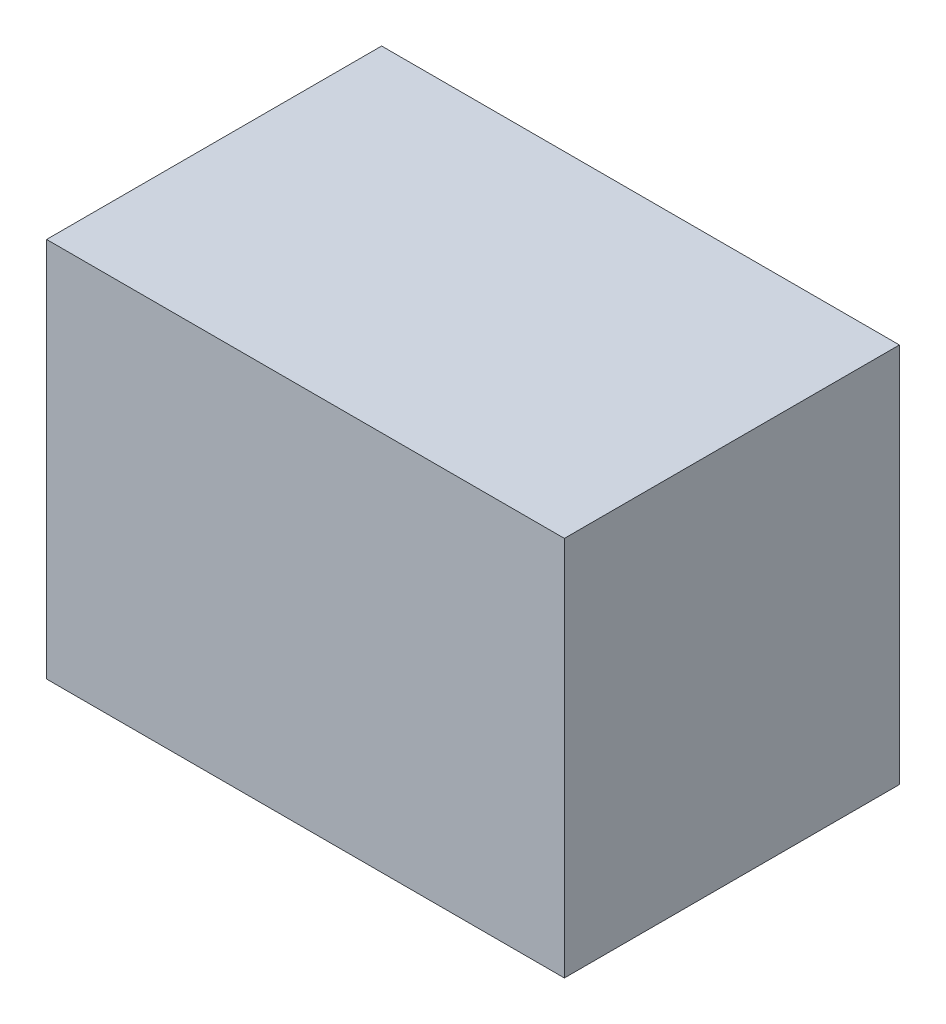
ISO-10303-21;
HEADER;
FILE_DESCRIPTION(('STEP AP214'),'2;1');
FILE_NAME('part.step','',(''),(''),'','','');
FILE_SCHEMA(('AUTOMOTIVE_DESIGN { 1 0 10303 214 1 1 1 1 }'));
ENDSEC;
DATA;
#1=APPLICATION_CONTEXT('core data for automotive mechanical design processes');
#2=APPLICATION_PROTOCOL_DEFINITION('international standard','automotive_design',2000,#1);
#3=PRODUCT_CONTEXT('',#1,'mechanical');
#4=PRODUCT('Part','Part','',(#3));
#5=PRODUCT_RELATED_PRODUCT_CATEGORY('part','',(#4));
#6=PRODUCT_DEFINITION_FORMATION('','',#4);
#7=PRODUCT_DEFINITION_CONTEXT('part definition',#1,'design');
#8=PRODUCT_DEFINITION('design','',#6,#7);
#9=PRODUCT_DEFINITION_SHAPE('','',#8);
#10=(LENGTH_UNIT() NAMED_UNIT(*) SI_UNIT(.MILLI.,.METRE.));
#11=(NAMED_UNIT(*) PLANE_ANGLE_UNIT() SI_UNIT($,.RADIAN.));
#12=(NAMED_UNIT(*) SI_UNIT($,.STERADIAN.) SOLID_ANGLE_UNIT());
#13=UNCERTAINTY_MEASURE_WITH_UNIT(LENGTH_MEASURE(1.E-05),#10,'distance_accuracy_value','');
#14=(GEOMETRIC_REPRESENTATION_CONTEXT(3) GLOBAL_UNCERTAINTY_ASSIGNED_CONTEXT((#13)) GLOBAL_UNIT_ASSIGNED_CONTEXT((#10,
#11,#12)) REPRESENTATION_CONTEXT('',''));
#15=CARTESIAN_POINT('',(0.,0.,0.));
#16=DIRECTION('',(0.,0.,1.));
#17=DIRECTION('',(1.,0.,0.));
#18=AXIS2_PLACEMENT_3D('',#15,#16,#17);
#19=CARTESIAN_POINT('',(-0.85000084,0.62500002,0.));
#20=DIRECTION('',(1.,0.,0.));
#21=DIRECTION('',(0.,-1.,0.));
#22=AXIS2_PLACEMENT_3D('',#19,#20,#21);
#23=PLANE('',#22);
#24=DIRECTION('',(0.,-1.,0.));
#25=VECTOR('',#24,1.);
#26=CARTESIAN_POINT('',(-0.85000084,0.62500002,0.));
#27=LINE('',#26,#25);
#28=CARTESIAN_POINT('',(-0.85000084,0.62500002,0.));
#29=VERTEX_POINT('',#28);
#30=CARTESIAN_POINT('',(-0.85000084,-0.62500002,0.));
#31=VERTEX_POINT('',#30);
#32=EDGE_CURVE('E11',#29,#31,#27,.T.);
#33=ORIENTED_EDGE('',*,*,#32,.T.);
#34=DIRECTION('',(0.,0.,1.));
#35=VECTOR('',#34,1.);
#36=CARTESIAN_POINT('',(-0.85000084,-0.62500002,0.));
#37=LINE('',#36,#35);
#38=CARTESIAN_POINT('',(-0.85000084,-0.62500002,1.10000034));
#39=VERTEX_POINT('',#38);
#40=EDGE_CURVE('E23',#31,#39,#37,.T.);
#41=ORIENTED_EDGE('',*,*,#40,.T.);
#42=DIRECTION('',(0.,-1.,0.));
#43=VECTOR('',#42,1.);
#44=CARTESIAN_POINT('',(-0.85000084,0.62500002,1.10000034));
#45=LINE('',#44,#43);
#46=CARTESIAN_POINT('',(-0.85000084,0.62500002,1.10000034));
#47=VERTEX_POINT('',#46);
#48=EDGE_CURVE('E86',#47,#39,#45,.T.);
#49=ORIENTED_EDGE('',*,*,#48,.F.);
#50=DIRECTION('',(0.,0.,1.));
#51=VECTOR('',#50,1.);
#52=CARTESIAN_POINT('',(-0.85000084,0.62500002,0.));
#53=LINE('',#52,#51);
#54=EDGE_CURVE('E35',#29,#47,#53,.T.);
#55=ORIENTED_EDGE('',*,*,#54,.F.);
#56=EDGE_LOOP('',(#33,#41,#49,#55));
#57=FACE_BOUND('',#56,.T.);
#58=ADVANCED_FACE('F16',(#57),#23,.F.);
#59=CARTESIAN_POINT('',(-0.85000084,-0.62500002,0.));
#60=DIRECTION('',(0.,1.,0.));
#61=DIRECTION('',(1.,0.,0.));
#62=AXIS2_PLACEMENT_3D('',#59,#60,#61);
#63=PLANE('',#62);
#64=DIRECTION('',(1.,0.,0.));
#65=VECTOR('',#64,1.);
#66=CARTESIAN_POINT('',(-0.85000084,-0.62500002,0.));
#67=LINE('',#66,#65);
#68=CARTESIAN_POINT('',(0.85000084,-0.62500002,0.));
#69=VERTEX_POINT('',#68);
#70=EDGE_CURVE('E83',#31,#69,#67,.T.);
#71=ORIENTED_EDGE('',*,*,#70,.T.);
#72=DIRECTION('',(0.,0.,1.));
#73=VECTOR('',#72,1.);
#74=CARTESIAN_POINT('',(0.85000084,-0.62500002,0.));
#75=LINE('',#74,#73);
#76=CARTESIAN_POINT('',(0.85000084,-0.62500002,1.10000034));
#77=VERTEX_POINT('',#76);
#78=EDGE_CURVE('E81',#69,#77,#75,.T.);
#79=ORIENTED_EDGE('',*,*,#78,.T.);
#80=DIRECTION('',(1.,0.,0.));
#81=VECTOR('',#80,1.);
#82=CARTESIAN_POINT('',(-0.85000084,-0.62500002,1.10000034));
#83=LINE('',#82,#81);
#84=EDGE_CURVE('E61',#39,#77,#83,.T.);
#85=ORIENTED_EDGE('',*,*,#84,.F.);
#86=ORIENTED_EDGE('',*,*,#40,.F.);
#87=EDGE_LOOP('',(#71,#79,#85,#86));
#88=FACE_BOUND('',#87,.T.);
#89=ADVANCED_FACE('F88',(#88),#63,.F.);
#90=CARTESIAN_POINT('',(0.85000084,-0.62500002,0.));
#91=DIRECTION('',(-1.,0.,0.));
#92=DIRECTION('',(0.,1.,0.));
#93=AXIS2_PLACEMENT_3D('',#90,#91,#92);
#94=PLANE('',#93);
#95=DIRECTION('',(0.,1.,0.));
#96=VECTOR('',#95,1.);
#97=CARTESIAN_POINT('',(0.85000084,-0.62500002,0.));
#98=LINE('',#97,#96);
#99=CARTESIAN_POINT('',(0.85000084,0.62500002,0.));
#100=VERTEX_POINT('',#99);
#101=EDGE_CURVE('E70',#69,#100,#98,.T.);
#102=ORIENTED_EDGE('',*,*,#101,.T.);
#103=DIRECTION('',(0.,0.,1.));
#104=VECTOR('',#103,1.);
#105=CARTESIAN_POINT('',(0.85000084,0.62500002,0.));
#106=LINE('',#105,#104);
#107=CARTESIAN_POINT('',(0.85000084,0.62500002,1.10000034));
#108=VERTEX_POINT('',#107);
#109=EDGE_CURVE('E64',#100,#108,#106,.T.);
#110=ORIENTED_EDGE('',*,*,#109,.T.);
#111=DIRECTION('',(0.,1.,0.));
#112=VECTOR('',#111,1.);
#113=CARTESIAN_POINT('',(0.85000084,-0.62500002,1.10000034));
#114=LINE('',#113,#112);
#115=EDGE_CURVE('E56',#77,#108,#114,.T.);
#116=ORIENTED_EDGE('',*,*,#115,.F.);
#117=ORIENTED_EDGE('',*,*,#78,.F.);
#118=EDGE_LOOP('',(#102,#110,#116,#117));
#119=FACE_BOUND('',#118,.T.);
#120=ADVANCED_FACE('F68',(#119),#94,.F.);
#121=CARTESIAN_POINT('',(0.85000084,0.62500002,0.));
#122=DIRECTION('',(0.,-1.,0.));
#123=DIRECTION('',(-1.,0.,0.));
#124=AXIS2_PLACEMENT_3D('',#121,#122,#123);
#125=PLANE('',#124);
#126=DIRECTION('',(-1.,0.,0.));
#127=VECTOR('',#126,1.);
#128=CARTESIAN_POINT('',(0.85000084,0.62500002,0.));
#129=LINE('',#128,#127);
#130=EDGE_CURVE('E65',#100,#29,#129,.T.);
#131=ORIENTED_EDGE('',*,*,#130,.T.);
#132=ORIENTED_EDGE('',*,*,#54,.T.);
#133=DIRECTION('',(-1.,0.,0.));
#134=VECTOR('',#133,1.);
#135=CARTESIAN_POINT('',(0.85000084,0.62500002,1.10000034));
#136=LINE('',#135,#134);
#137=EDGE_CURVE('E60',#108,#47,#136,.T.);
#138=ORIENTED_EDGE('',*,*,#137,.F.);
#139=ORIENTED_EDGE('',*,*,#109,.F.);
#140=EDGE_LOOP('',(#131,#132,#138,#139));
#141=FACE_BOUND('',#140,.T.);
#142=ADVANCED_FACE('F75',(#141),#125,.F.);
#143=CARTESIAN_POINT('',(-0.85000084,0.62500002,0.));
#144=DIRECTION('',(0.,0.,-1.));
#145=DIRECTION('',(-1.,0.,0.));
#146=AXIS2_PLACEMENT_3D('',#143,#144,#145);
#147=PLANE('',#146);
#148=ORIENTED_EDGE('',*,*,#130,.F.);
#149=ORIENTED_EDGE('',*,*,#101,.F.);
#150=ORIENTED_EDGE('',*,*,#70,.F.);
#151=ORIENTED_EDGE('',*,*,#32,.F.);
#152=EDGE_LOOP('',(#148,#149,#150,#151));
#153=FACE_BOUND('',#152,.T.);
#154=ADVANCED_FACE('F90',(#153),#147,.T.);
#155=CARTESIAN_POINT('',(-0.85000084,0.62500002,1.10000034));
#156=DIRECTION('',(0.,0.,-1.));
#157=DIRECTION('',(-1.,0.,0.));
#158=AXIS2_PLACEMENT_3D('',#155,#156,#157);
#159=PLANE('',#158);
#160=ORIENTED_EDGE('',*,*,#48,.T.);
#161=ORIENTED_EDGE('',*,*,#84,.T.);
#162=ORIENTED_EDGE('',*,*,#115,.T.);
#163=ORIENTED_EDGE('',*,*,#137,.T.);
#164=EDGE_LOOP('',(#160,#161,#162,#163));
#165=FACE_BOUND('',#164,.T.);
#166=ADVANCED_FACE('F58',(#165),#159,.F.);
#167=CLOSED_SHELL('',(#58,#89,#120,#142,#154,#166));
#168=MANIFOLD_SOLID_BREP('B1',#167);
#169=ADVANCED_BREP_SHAPE_REPRESENTATION('',(#18,#168),#14);
#170=SHAPE_DEFINITION_REPRESENTATION(#9,#169);
ENDSEC;
END-ISO-10303-21;
